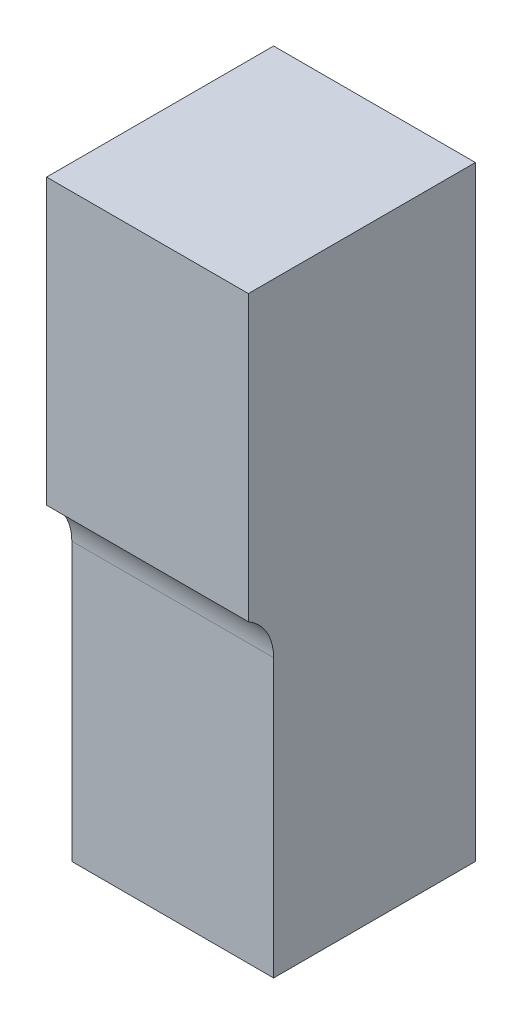
ISO-10303-21;
HEADER;
FILE_DESCRIPTION(('STEP AP214'),'2;1');
FILE_NAME('part.step','',(''),(''),'','','');
FILE_SCHEMA(('AUTOMOTIVE_DESIGN { 1 0 10303 214 1 1 1 1 }'));
ENDSEC;
DATA;
#1=APPLICATION_CONTEXT('core data for automotive mechanical design processes');
#2=APPLICATION_PROTOCOL_DEFINITION('international standard','automotive_design',2000,#1);
#3=PRODUCT_CONTEXT('',#1,'mechanical');
#4=PRODUCT('Part','Part','',(#3));
#5=PRODUCT_RELATED_PRODUCT_CATEGORY('part','',(#4));
#6=PRODUCT_DEFINITION_FORMATION('','',#4);
#7=PRODUCT_DEFINITION_CONTEXT('part definition',#1,'design');
#8=PRODUCT_DEFINITION('design','',#6,#7);
#9=PRODUCT_DEFINITION_SHAPE('','',#8);
#10=(LENGTH_UNIT() NAMED_UNIT(*) SI_UNIT(.MILLI.,.METRE.));
#11=(NAMED_UNIT(*) PLANE_ANGLE_UNIT() SI_UNIT($,.RADIAN.));
#12=(NAMED_UNIT(*) SI_UNIT($,.STERADIAN.) SOLID_ANGLE_UNIT());
#13=UNCERTAINTY_MEASURE_WITH_UNIT(LENGTH_MEASURE(1.E-05),#10,'distance_accuracy_value','');
#14=(GEOMETRIC_REPRESENTATION_CONTEXT(3) GLOBAL_UNCERTAINTY_ASSIGNED_CONTEXT((#13)) GLOBAL_UNIT_ASSIGNED_CONTEXT((#10,
#11,#12)) REPRESENTATION_CONTEXT('',''));
#15=CARTESIAN_POINT('',(0.,0.,0.));
#16=DIRECTION('',(0.,0.,1.));
#17=DIRECTION('',(1.,0.,0.));
#18=AXIS2_PLACEMENT_3D('',#15,#16,#17);
#19=CARTESIAN_POINT('',(25.4,0.,25.4));
#20=DIRECTION('',(0.,1.,0.));
#21=DIRECTION('',(0.,0.,1.));
#22=AXIS2_PLACEMENT_3D('',#19,#20,#21);
#23=PLANE('',#22);
#24=DIRECTION('',(0.,0.,-1.));
#25=VECTOR('',#24,1.);
#26=CARTESIAN_POINT('',(0.,0.,25.4));
#27=LINE('',#26,#25);
#28=CARTESIAN_POINT('',(0.,0.,25.4));
#29=VERTEX_POINT('',#28);
#30=CARTESIAN_POINT('',(0.,0.,0.));
#31=VERTEX_POINT('',#30);
#32=EDGE_CURVE('E133',#29,#31,#27,.T.);
#33=ORIENTED_EDGE('',*,*,#32,.T.);
#34=DIRECTION('',(-1.,0.,0.));
#35=VECTOR('',#34,1.);
#36=CARTESIAN_POINT('',(25.4,0.,0.));
#37=LINE('',#36,#35);
#38=CARTESIAN_POINT('',(25.4,0.,0.));
#39=VERTEX_POINT('',#38);
#40=EDGE_CURVE('E11',#39,#31,#37,.T.);
#41=ORIENTED_EDGE('',*,*,#40,.F.);
#42=DIRECTION('',(0.,0.,-1.));
#43=VECTOR('',#42,1.);
#44=CARTESIAN_POINT('',(25.4,0.,25.4));
#45=LINE('',#44,#43);
#46=CARTESIAN_POINT('',(25.4,0.,25.4));
#47=VERTEX_POINT('',#46);
#48=EDGE_CURVE('E150',#47,#39,#45,.T.);
#49=ORIENTED_EDGE('',*,*,#48,.F.);
#50=DIRECTION('',(-1.,0.,0.));
#51=VECTOR('',#50,1.);
#52=CARTESIAN_POINT('',(25.4,0.,25.4));
#53=LINE('',#52,#51);
#54=EDGE_CURVE('E129',#47,#29,#53,.T.);
#55=ORIENTED_EDGE('',*,*,#54,.T.);
#56=EDGE_LOOP('',(#33,#41,#49,#55));
#57=FACE_BOUND('',#56,.T.);
#58=ADVANCED_FACE('F45',(#57),#23,.F.);
#59=CARTESIAN_POINT('',(25.4,0.,0.));
#60=DIRECTION('',(0.,0.,1.));
#61=DIRECTION('',(1.,0.,0.));
#62=AXIS2_PLACEMENT_3D('',#59,#60,#61);
#63=PLANE('',#62);
#64=DIRECTION('',(0.,1.,0.));
#65=VECTOR('',#64,1.);
#66=CARTESIAN_POINT('',(0.,0.,0.));
#67=LINE('',#66,#65);
#68=CARTESIAN_POINT('',(0.,76.2,0.));
#69=VERTEX_POINT('',#68);
#70=EDGE_CURVE('E137',#31,#69,#67,.T.);
#71=ORIENTED_EDGE('',*,*,#70,.T.);
#72=DIRECTION('',(-1.,0.,0.));
#73=VECTOR('',#72,1.);
#74=CARTESIAN_POINT('',(25.4,76.2,0.));
#75=LINE('',#74,#73);
#76=CARTESIAN_POINT('',(25.4,76.2,0.));
#77=VERTEX_POINT('',#76);
#78=EDGE_CURVE('E54',#77,#69,#75,.T.);
#79=ORIENTED_EDGE('',*,*,#78,.F.);
#80=DIRECTION('',(0.,1.,0.));
#81=VECTOR('',#80,1.);
#82=CARTESIAN_POINT('',(25.4,0.,0.));
#83=LINE('',#82,#81);
#84=EDGE_CURVE('E95',#39,#77,#83,.T.);
#85=ORIENTED_EDGE('',*,*,#84,.F.);
#86=ORIENTED_EDGE('',*,*,#40,.T.);
#87=EDGE_LOOP('',(#71,#79,#85,#86));
#88=FACE_BOUND('',#87,.T.);
#89=ADVANCED_FACE('F178',(#88),#63,.F.);
#90=CARTESIAN_POINT('',(25.4,76.2,0.));
#91=DIRECTION('',(0.,-1.,0.));
#92=DIRECTION('',(0.,0.,-1.));
#93=AXIS2_PLACEMENT_3D('',#90,#91,#92);
#94=PLANE('',#93);
#95=DIRECTION('',(0.,0.,1.));
#96=VECTOR('',#95,1.);
#97=CARTESIAN_POINT('',(0.,76.2,0.));
#98=LINE('',#97,#96);
#99=CARTESIAN_POINT('',(0.,76.2,28.575));
#100=VERTEX_POINT('',#99);
#101=EDGE_CURVE('E140',#69,#100,#98,.T.);
#102=ORIENTED_EDGE('',*,*,#101,.T.);
#103=DIRECTION('',(-1.,0.,0.));
#104=VECTOR('',#103,1.);
#105=CARTESIAN_POINT('',(25.4,76.2,28.575));
#106=LINE('',#105,#104);
#107=CARTESIAN_POINT('',(25.4,76.2,28.575));
#108=VERTEX_POINT('',#107);
#109=EDGE_CURVE('E123',#108,#100,#106,.T.);
#110=ORIENTED_EDGE('',*,*,#109,.F.);
#111=DIRECTION('',(0.,0.,1.));
#112=VECTOR('',#111,1.);
#113=CARTESIAN_POINT('',(25.4,76.2,0.));
#114=LINE('',#113,#112);
#115=EDGE_CURVE('E108',#77,#108,#114,.T.);
#116=ORIENTED_EDGE('',*,*,#115,.F.);
#117=ORIENTED_EDGE('',*,*,#78,.T.);
#118=EDGE_LOOP('',(#102,#110,#116,#117));
#119=FACE_BOUND('',#118,.T.);
#120=ADVANCED_FACE('F160',(#119),#94,.F.);
#121=CARTESIAN_POINT('',(25.4,76.2,28.575));
#122=DIRECTION('',(0.,0.,-1.));
#123=DIRECTION('',(0.,1.,0.));
#124=AXIS2_PLACEMENT_3D('',#121,#122,#123);
#125=PLANE('',#124);
#126=DIRECTION('',(0.,-1.,0.));
#127=VECTOR('',#126,1.);
#128=CARTESIAN_POINT('',(0.,76.2,28.575));
#129=LINE('',#128,#127);
#130=CARTESIAN_POINT('',(0.,40.4242613140312,28.575));
#131=VERTEX_POINT('',#130);
#132=EDGE_CURVE('E118',#100,#131,#129,.T.);
#133=ORIENTED_EDGE('',*,*,#132,.T.);
#134=DIRECTION('',(-1.,0.,0.));
#135=VECTOR('',#134,1.);
#136=CARTESIAN_POINT('',(25.4,40.4242613140312,28.575));
#137=LINE('',#136,#135);
#138=CARTESIAN_POINT('',(25.4,40.4242613140312,28.575));
#139=VERTEX_POINT('',#138);
#140=EDGE_CURVE('E115',#139,#131,#137,.T.);
#141=ORIENTED_EDGE('',*,*,#140,.F.);
#142=DIRECTION('',(0.,-1.,0.));
#143=VECTOR('',#142,1.);
#144=CARTESIAN_POINT('',(25.4,76.2,28.575));
#145=LINE('',#144,#143);
#146=EDGE_CURVE('E102',#108,#139,#145,.T.);
#147=ORIENTED_EDGE('',*,*,#146,.F.);
#148=ORIENTED_EDGE('',*,*,#109,.T.);
#149=EDGE_LOOP('',(#133,#141,#147,#148));
#150=FACE_BOUND('',#149,.T.);
#151=ADVANCED_FACE('F116',(#150),#125,.F.);
#152=CARTESIAN_POINT('',(25.4,34.925,31.75));
#153=DIRECTION('',(-1.,0.,0.));
#154=DIRECTION('',(0.,0.,1.));
#155=AXIS2_PLACEMENT_3D('',#152,#153,#154);
#156=CYLINDRICAL_SURFACE('',#155,6.35);
#157=CARTESIAN_POINT('',(0.,34.925,31.75));
#158=DIRECTION('',(1.,0.,0.));
#159=DIRECTION('',(0.,0.,-1.));
#160=AXIS2_PLACEMENT_3D('',#157,#158,#159);
#161=CIRCLE('',#160,6.35);
#162=CARTESIAN_POINT('',(0.,34.925,25.4));
#163=VERTEX_POINT('',#162);
#164=EDGE_CURVE('E145',#163,#131,#161,.T.);
#165=ORIENTED_EDGE('',*,*,#164,.F.);
#166=DIRECTION('',(-1.,0.,0.));
#167=VECTOR('',#166,1.);
#168=CARTESIAN_POINT('',(25.4,34.925,25.4));
#169=LINE('',#168,#167);
#170=CARTESIAN_POINT('',(25.4,34.925,25.4));
#171=VERTEX_POINT('',#170);
#172=EDGE_CURVE('E84',#171,#163,#169,.T.);
#173=ORIENTED_EDGE('',*,*,#172,.F.);
#174=CARTESIAN_POINT('',(25.4,34.925,31.75));
#175=DIRECTION('',(1.,0.,0.));
#176=DIRECTION('',(0.,0.,-1.));
#177=AXIS2_PLACEMENT_3D('',#174,#175,#176);
#178=CIRCLE('',#177,6.35);
#179=EDGE_CURVE('E106',#171,#139,#178,.T.);
#180=ORIENTED_EDGE('',*,*,#179,.T.);
#181=ORIENTED_EDGE('',*,*,#140,.T.);
#182=EDGE_LOOP('',(#165,#173,#180,#181));
#183=FACE_BOUND('',#182,.T.);
#184=ADVANCED_FACE('F125',(#183),#156,.F.);
#185=CARTESIAN_POINT('',(25.4,34.925,25.4));
#186=DIRECTION('',(0.,0.,-1.));
#187=DIRECTION('',(-1.,0.,0.));
#188=AXIS2_PLACEMENT_3D('',#185,#186,#187);
#189=PLANE('',#188);
#190=DIRECTION('',(0.,-1.,0.));
#191=VECTOR('',#190,1.);
#192=CARTESIAN_POINT('',(0.,34.925,25.4));
#193=LINE('',#192,#191);
#194=EDGE_CURVE('E87',#163,#29,#193,.T.);
#195=ORIENTED_EDGE('',*,*,#194,.T.);
#196=ORIENTED_EDGE('',*,*,#54,.F.);
#197=DIRECTION('',(0.,-1.,0.));
#198=VECTOR('',#197,1.);
#199=CARTESIAN_POINT('',(25.4,34.925,25.4));
#200=LINE('',#199,#198);
#201=EDGE_CURVE('E62',#171,#47,#200,.T.);
#202=ORIENTED_EDGE('',*,*,#201,.F.);
#203=ORIENTED_EDGE('',*,*,#172,.T.);
#204=EDGE_LOOP('',(#195,#196,#202,#203));
#205=FACE_BOUND('',#204,.T.);
#206=ADVANCED_FACE('F167',(#205),#189,.F.);
#207=CARTESIAN_POINT('',(25.4,34.925,31.75));
#208=DIRECTION('',(1.,0.,0.));
#209=DIRECTION('',(0.,0.,-1.));
#210=AXIS2_PLACEMENT_3D('',#207,#208,#209);
#211=PLANE('',#210);
#212=ORIENTED_EDGE('',*,*,#48,.T.);
#213=ORIENTED_EDGE('',*,*,#84,.T.);
#214=ORIENTED_EDGE('',*,*,#115,.T.);
#215=ORIENTED_EDGE('',*,*,#146,.T.);
#216=ORIENTED_EDGE('',*,*,#179,.F.);
#217=ORIENTED_EDGE('',*,*,#201,.T.);
#218=EDGE_LOOP('',(#212,#213,#214,#215,#216,#217));
#219=FACE_BOUND('',#218,.T.);
#220=ADVANCED_FACE('F104',(#219),#211,.T.);
#221=CARTESIAN_POINT('',(0.,34.925,31.75));
#222=DIRECTION('',(1.,0.,0.));
#223=DIRECTION('',(0.,0.,-1.));
#224=AXIS2_PLACEMENT_3D('',#221,#222,#223);
#225=PLANE('',#224);
#226=ORIENTED_EDGE('',*,*,#32,.F.);
#227=ORIENTED_EDGE('',*,*,#194,.F.);
#228=ORIENTED_EDGE('',*,*,#164,.T.);
#229=ORIENTED_EDGE('',*,*,#132,.F.);
#230=ORIENTED_EDGE('',*,*,#101,.F.);
#231=ORIENTED_EDGE('',*,*,#70,.F.);
#232=EDGE_LOOP('',(#226,#227,#228,#229,#230,#231));
#233=FACE_BOUND('',#232,.T.);
#234=ADVANCED_FACE('F163',(#233),#225,.F.);
#235=CLOSED_SHELL('',(#58,#89,#120,#151,#184,#206,#220,#234));
#236=MANIFOLD_SOLID_BREP('B2',#235);
#237=ADVANCED_BREP_SHAPE_REPRESENTATION('',(#18,#236),#14);
#238=SHAPE_DEFINITION_REPRESENTATION(#9,#237);
ENDSEC;
END-ISO-10303-21;
